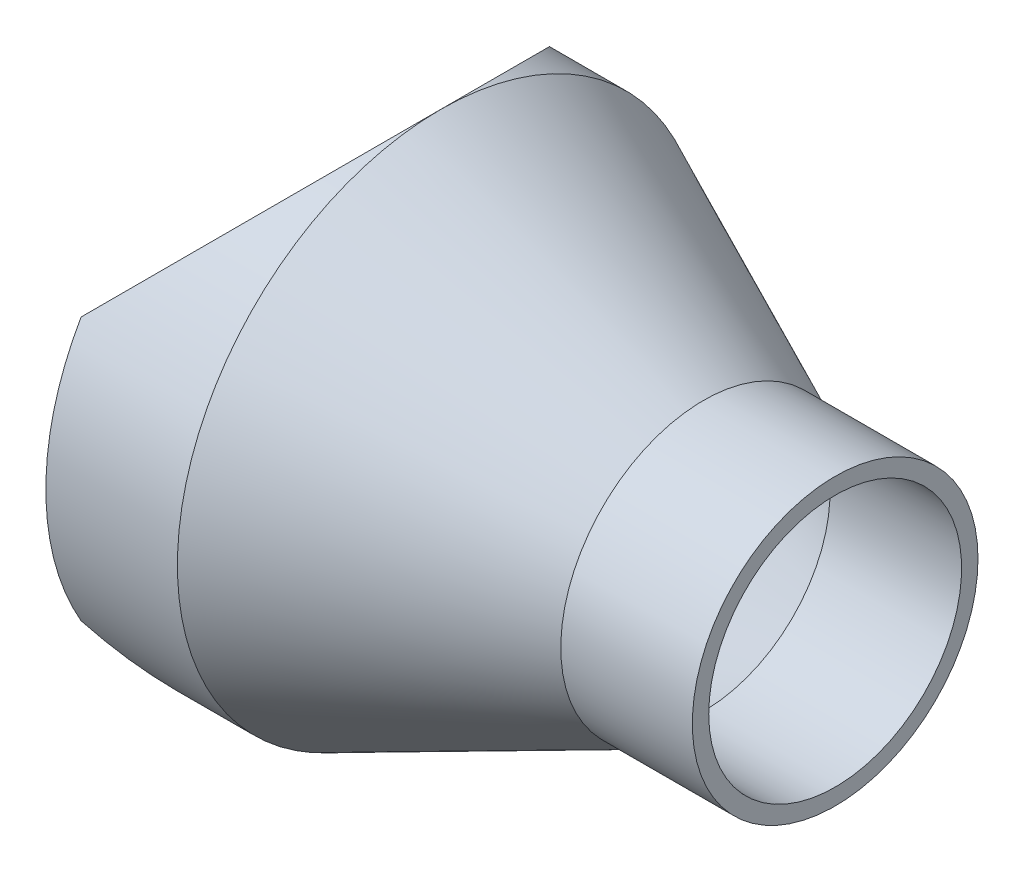
ISO-10303-21;
HEADER;
FILE_DESCRIPTION(('STEP AP214'),'2;1');
FILE_NAME('part.step','',(''),(''),'','','');
FILE_SCHEMA(('AUTOMOTIVE_DESIGN { 1 0 10303 214 1 1 1 1 }'));
ENDSEC;
DATA;
#1=APPLICATION_CONTEXT('core data for automotive mechanical design processes');
#2=APPLICATION_PROTOCOL_DEFINITION('international standard','automotive_design',2000,#1);
#3=PRODUCT_CONTEXT('',#1,'mechanical');
#4=PRODUCT('Part','Part','',(#3));
#5=PRODUCT_RELATED_PRODUCT_CATEGORY('part','',(#4));
#6=PRODUCT_DEFINITION_FORMATION('','',#4);
#7=PRODUCT_DEFINITION_CONTEXT('part definition',#1,'design');
#8=PRODUCT_DEFINITION('design','',#6,#7);
#9=PRODUCT_DEFINITION_SHAPE('','',#8);
#10=(LENGTH_UNIT() NAMED_UNIT(*) SI_UNIT(.MILLI.,.METRE.));
#11=(NAMED_UNIT(*) PLANE_ANGLE_UNIT() SI_UNIT($,.RADIAN.));
#12=(NAMED_UNIT(*) SI_UNIT($,.STERADIAN.) SOLID_ANGLE_UNIT());
#13=UNCERTAINTY_MEASURE_WITH_UNIT(LENGTH_MEASURE(1.E-05),#10,'distance_accuracy_value','');
#14=(GEOMETRIC_REPRESENTATION_CONTEXT(3) GLOBAL_UNCERTAINTY_ASSIGNED_CONTEXT((#13)) GLOBAL_UNIT_ASSIGNED_CONTEXT((#10,
#11,#12)) REPRESENTATION_CONTEXT('',''));
#15=CARTESIAN_POINT('',(0.,0.,0.));
#16=DIRECTION('',(0.,0.,1.));
#17=DIRECTION('',(1.,0.,0.));
#18=AXIS2_PLACEMENT_3D('',#15,#16,#17);
#19=CARTESIAN_POINT('',(22.2249999999994,0.,0.));
#20=DIRECTION('',(-1.,0.,0.));
#21=DIRECTION('',(0.,0.,1.));
#22=AXIS2_PLACEMENT_3D('',#19,#20,#21);
#23=CONICAL_SURFACE('',#22,41.4019999999986,0.423566498160204);
#24=CARTESIAN_POINT('',(66.675,0.,1.18438592267012E-13));
#25=DIRECTION('',(-1.,0.,0.));
#26=DIRECTION('',(0.,0.,1.));
#27=AXIS2_PLACEMENT_3D('',#24,#25,#26);
#28=CIRCLE('',#27,21.3614);
#29=CARTESIAN_POINT('',(66.675,0.,21.3614000000001));
#30=VERTEX_POINT('',#29);
#31=EDGE_CURVE('E105',#30,#30,#28,.F.);
#32=ORIENTED_EDGE('',*,*,#31,.T.);
#33=EDGE_LOOP('',(#32));
#34=FACE_BOUND('',#33,.T.);
#35=CARTESIAN_POINT('',(22.225,0.,0.));
#36=DIRECTION('',(-1.,0.,0.));
#37=DIRECTION('',(0.,0.,1.));
#38=AXIS2_PLACEMENT_3D('',#35,#36,#37);
#39=CIRCLE('',#38,41.402);
#40=CARTESIAN_POINT('',(22.2249999999982,-41.4019999999993,0.));
#41=VERTEX_POINT('',#40);
#42=CARTESIAN_POINT('',(22.2249999999982,41.4019999999993,0.));
#43=VERTEX_POINT('',#42);
#44=EDGE_CURVE('E103',#41,#43,#39,.T.);
#45=ORIENTED_EDGE('',*,*,#44,.T.);
#46=CARTESIAN_POINT('',(22.225,0.,0.));
#47=DIRECTION('',(-1.,0.,0.));
#48=DIRECTION('',(0.,0.,1.));
#49=AXIS2_PLACEMENT_3D('',#46,#47,#48);
#50=CIRCLE('',#49,41.402);
#51=EDGE_CURVE('E71',#43,#41,#50,.T.);
#52=ORIENTED_EDGE('',*,*,#51,.T.);
#53=EDGE_LOOP('',(#45,#52));
#54=FACE_BOUND('',#53,.T.);
#55=ADVANCED_FACE('F18',(#34,#54),#23,.F.);
#56=CARTESIAN_POINT('',(77.7875,0.,1.38178357644847E-13));
#57=DIRECTION('',(-1.,0.,0.));
#58=DIRECTION('',(0.,0.,1.));
#59=AXIS2_PLACEMENT_3D('',#56,#57,#58);
#60=CYLINDRICAL_SURFACE('',#59,21.3614);
#61=ORIENTED_EDGE('',*,*,#31,.F.);
#62=EDGE_LOOP('',(#61));
#63=FACE_BOUND('',#62,.T.);
#64=CARTESIAN_POINT('',(88.9,0.,1.57918123022682E-13));
#65=DIRECTION('',(-1.,0.,0.));
#66=DIRECTION('',(0.,0.,1.));
#67=AXIS2_PLACEMENT_3D('',#64,#65,#66);
#68=CIRCLE('',#67,21.3614);
#69=CARTESIAN_POINT('',(88.9,0.,21.3614000000002));
#70=VERTEX_POINT('',#69);
#71=EDGE_CURVE('E83',#70,#70,#68,.T.);
#72=ORIENTED_EDGE('',*,*,#71,.F.);
#73=EDGE_LOOP('',(#72));
#74=FACE_BOUND('',#73,.T.);
#75=ADVANCED_FACE('F166',(#63,#74),#60,.F.);
#76=CARTESIAN_POINT('',(11.1125,0.,0.));
#77=DIRECTION('',(-1.,0.,0.));
#78=DIRECTION('',(0.,0.,1.));
#79=AXIS2_PLACEMENT_3D('',#76,#77,#78);
#80=CYLINDRICAL_SURFACE('',#79,41.402);
#81=CARTESIAN_POINT('',(-1.50573997714787E-12,15.2405291574778,38.4948291982192));
#82=CARTESIAN_POINT('',(0.235429066097039,15.5838070863418,38.3589123540987));
#83=CARTESIAN_POINT('',(0.472920084740966,15.9240358700112,38.2189094271438));
#84=CARTESIAN_POINT('',(0.951190686752303,16.5986708903238,37.9307849976196));
#85=CARTESIAN_POINT('',(1.19197011775378,16.9330773951152,37.7826638702488));
#86=CARTESIAN_POINT('',(1.67597580964683,17.5963364836633,37.4783618549025));
#87=CARTESIAN_POINT('',(1.91920178123171,17.9251897120637,37.3221819110787));
#88=CARTESIAN_POINT('',(2.40744201135867,18.5775964235961,37.0017645687544));
#89=CARTESIAN_POINT('',(2.65245629426212,18.9011498343354,36.8375270603143));
#90=CARTESIAN_POINT('',(3.38993843899628,19.8650427515623,36.3322549818683));
#91=CARTESIAN_POINT('',(3.88418348208196,20.497713398756,35.9790749494401));
#92=CARTESIAN_POINT('',(4.87314660852457,21.7434086430539,35.2402344030287));
#93=CARTESIAN_POINT('',(5.36786470884381,22.3564325062301,34.8545726776023));
#94=CARTESIAN_POINT('',(6.3598023214071,23.5698421441031,34.045933689596));
#95=CARTESIAN_POINT('',(6.85698799828429,24.170010108916,33.6225875609375));
#96=CARTESIAN_POINT('',(7.84506977508413,25.3502721481776,32.7418913504769));
#97=CARTESIAN_POINT('',(8.33596579544579,25.9303659688561,32.2845408390334));
#98=CARTESIAN_POINT('',(9.30816420428777,27.0693830542778,31.335652651674));
#99=CARTESIAN_POINT('',(9.78947284658706,27.6283203489089,30.8441382674191));
#100=CARTESIAN_POINT('',(10.7398853080548,28.7242253096646,29.8262252868519));
#101=CARTESIAN_POINT('',(11.2089903466652,29.2611951739729,29.2998301947759));
#102=CARTESIAN_POINT('',(12.2936907410822,30.4955371462987,28.0212424097446));
#103=CARTESIAN_POINT('',(12.9031381205121,31.1833254677025,27.2544680531471));
#104=CARTESIAN_POINT('',(14.0872512599329,32.5114282470544,25.6556516355744));
#105=CARTESIAN_POINT('',(14.661918839661,33.1517451891794,24.8236129945752));
#106=CARTESIAN_POINT('',(15.7666429154123,34.3767038359366,23.0972697577161));
#107=CARTESIAN_POINT('',(16.2968543459491,34.9615399217948,22.2032031117847));
#108=CARTESIAN_POINT('',(17.3065109317384,36.070989578491,20.3512581007955));
#109=CARTESIAN_POINT('',(17.7859670823885,36.5956161949205,19.3933936301685));
#110=CARTESIAN_POINT('',(18.5976854652784,37.4811904709232,17.6089729718717));
#111=CARTESIAN_POINT('',(18.9404375874837,37.8541255122263,16.7931220500313));
#112=CARTESIAN_POINT('',(19.5824184075783,38.5512882225112,15.1241956325357));
#113=CARTESIAN_POINT('',(19.8816489477699,38.8755179532457,14.2711217145474));
#114=CARTESIAN_POINT('',(20.4314129512581,39.4703120476721,12.5324851092693));
#115=CARTESIAN_POINT('',(20.6820082356816,39.7409445488082,11.6469653901823));
#116=CARTESIAN_POINT('',(21.1304097368758,40.2246553705623,9.8473418990263));
#117=CARTESIAN_POINT('',(21.3282290253929,40.4377479430334,8.93324526776924));
#118=CARTESIAN_POINT('',(21.6169693420651,40.7485411576906,7.35682971559445));
#119=CARTESIAN_POINT('',(21.7221985642238,40.8617258524818,6.70011807867637));
#120=CARTESIAN_POINT('',(21.9034799513035,41.05663327395,5.37816218438005));
#121=CARTESIAN_POINT('',(21.979538533573,41.1383629205442,4.71291983701976));
#122=CARTESIAN_POINT('',(22.1018160048938,41.269726199574,3.37467970463411));
#123=CARTESIAN_POINT('',(22.1479545353336,41.319273397675,2.70166593498327));
#124=CARTESIAN_POINT('',(22.194151760926,41.368879342499,1.68985886380406));
#125=CARTESIAN_POINT('',(22.2057157530706,41.3812955271362,1.35212250581984));
#126=CARTESIAN_POINT('',(22.2211408532731,41.3978567771998,0.676265961891813));
#127=CARTESIAN_POINT('',(22.2250018369861,41.4020017091088,0.338145769840168));
#128=CARTESIAN_POINT('',(22.225,41.4019999999999,0.));
#129=B_SPLINE_CURVE_WITH_KNOTS('',3,(#81,#82,#83,#84,#85,#86,#87,#88,#89,#90,#91,#92,#93,#94,
#95,#96,#97,#98,#99,#100,#101,#102,#103,#104,#105,#106,#107,#108,#109,#110,#111,#112,#113,#114,
#115,#116,#117,#118,#119,#120,#121,#122,#123,#124,#125,#126,#127,#128),.UNSPECIFIED.,.F.,.F.,(4,
2,2,2,2,2,2,2,2,2,2,2,2,2,2,2,2,2,2,2,2,2,2,4),(0.,1.31358912647946,2.62711759397459,
3.94049251949133,5.25388537004443,7.8842461818138,10.5147051394646,13.1745619169049,
15.8344523070409,18.4925467404338,21.1503745361742,24.7377726528005,28.3249829081953,
31.8991211401375,35.4724834953112,38.3507013936524,41.228797419309,44.1032107353481,
46.9769114441144,48.9995600314854,51.0217633939074,53.0493756947168,54.0636983846912,
55.0780374481009),.UNSPECIFIED.);
#130=CARTESIAN_POINT('',(-1.196959198424E-12,15.2405291574782,38.494829198219));
#131=VERTEX_POINT('',#130);
#132=EDGE_CURVE('E76',#131,#43,#129,.T.);
#133=ORIENTED_EDGE('',*,*,#132,.T.);
#134=ORIENTED_EDGE('',*,*,#44,.F.);
#135=CARTESIAN_POINT('',(22.225,-41.4019999999999,0.));
#136=CARTESIAN_POINT('',(22.225015024021,-41.4020147610362,0.476649651600231));
#137=CARTESIAN_POINT('',(22.2173334510359,-41.3937690065097,0.953290041539717));
#138=CARTESIAN_POINT('',(22.1866894108465,-41.360867085597,1.90548964470357));
#139=CARTESIAN_POINT('',(22.1637276866474,-41.3362117171369,2.38104890937006));
#140=CARTESIAN_POINT('',(22.1026583005644,-41.2706255219092,3.32971789097985));
#141=CARTESIAN_POINT('',(22.0645618955001,-41.2297067914375,3.80282916433853));
#142=CARTESIAN_POINT('',(21.9734546556202,-41.1318223902823,4.74590915486049));
#143=CARTESIAN_POINT('',(21.9204437342321,-41.0748566264526,5.21587785376627));
#144=CARTESIAN_POINT('',(21.7404358994949,-40.8813519527827,6.61193856744317));
#145=CARTESIAN_POINT('',(21.5919369032945,-40.7216404732032,7.5322389846748));
#146=CARTESIAN_POINT('',(21.2403891094285,-40.3431290026959,9.34986888284318));
#147=CARTESIAN_POINT('',(21.0373327880229,-40.1243208620082,10.2471951768203));
#148=CARTESIAN_POINT('',(20.5811938339779,-39.632081332075,12.0108085915545));
#149=CARTESIAN_POINT('',(20.3282506334947,-39.3588021653747,12.8771744494351));
#150=CARTESIAN_POINT('',(19.7763538289742,-38.7614484218074,14.5769484501027));
#151=CARTESIAN_POINT('',(19.4774017589625,-38.4373755384958,15.4103576905635));
#152=CARTESIAN_POINT('',(18.8374892591557,-37.7421466530405,17.0424205742767));
#153=CARTESIAN_POINT('',(18.4964575296188,-37.3709107054342,17.8410120368052));
#154=CARTESIAN_POINT('',(17.777375544008,-36.5860338102199,19.3997287450738));
#155=CARTESIAN_POINT('',(17.3993204324267,-36.1723873002568,20.1598489255377));
#156=CARTESIAN_POINT('',(16.4517273829049,-35.1322533633663,21.9384860171736));
#157=CARTESIAN_POINT('',(15.8663945589395,-34.4871423655075,22.937770511638));
#158=CARTESIAN_POINT('',(14.6431507214339,-33.1310936711278,24.8563355269555));
#159=CARTESIAN_POINT('',(14.0052209814092,-32.420132518258,25.7755873115684));
#160=CARTESIAN_POINT('',(12.6855096919357,-30.9383395198577,27.5367606908141));
#161=CARTESIAN_POINT('',(12.0035987447332,-30.1673294807314,28.3784345857581));
#162=CARTESIAN_POINT('',(10.6078140186468,-28.5738443062427,29.9823135097052));
#163=CARTESIAN_POINT('',(9.8939422652536,-27.7513724309238,30.7445235645044));
#164=CARTESIAN_POINT('',(8.41634605782015,-26.0273087228184,32.2186216851702));
#165=CARTESIAN_POINT('',(7.65175704094319,-25.123901913926,32.9275221768553));
#166=CARTESIAN_POINT('',(6.49535023432495,-23.7328362761767,33.9294034144256));
#167=CARTESIAN_POINT('',(6.10824866363595,-23.2630986268757,34.2531528723291));
#168=CARTESIAN_POINT('',(5.33238980002331,-22.3116299389994,34.8803884237881));
#169=CARTESIAN_POINT('',(4.94363261443981,-21.829899668429,35.1838758103628));
#170=CARTESIAN_POINT('',(4.16963621284936,-20.858695886219,35.7681238190191));
#171=CARTESIAN_POINT('',(3.784396652198,-20.3693302680047,36.0490635393685));
#172=CARTESIAN_POINT('',(3.0158511057519,-19.3783779828488,36.5912978643994));
#173=CARTESIAN_POINT('',(2.63254505704099,-18.8767917167022,36.8525931122063));
#174=CARTESIAN_POINT('',(1.8701179676878,-17.8608678873232,37.3555384019048));
#175=CARTESIAN_POINT('',(1.49099624922846,-17.3465324344745,37.5971916671843));
#176=CARTESIAN_POINT('',(0.92743896426164,-16.5647544884543,37.9449052908015));
#177=CARTESIAN_POINT('',(0.740428366175091,-16.3024314191972,38.0583559083493));
#178=CARTESIAN_POINT('',(0.368523929768501,-15.7742041633433,38.2803096924151));
#179=CARTESIAN_POINT('',(0.183630153473516,-15.5082998723074,38.3888127142399));
#180=CARTESIAN_POINT('',(-1.49880108324396E-12,-15.2405291574778,38.4948291982192));
#181=B_SPLINE_CURVE_WITH_KNOTS('',3,(#135,#136,#137,#138,#139,#140,#141,#142,#143,#144,#145,
#146,#147,#148,#149,#150,#151,#152,#153,#154,#155,#156,#157,#158,#159,#160,#161,#162,#163,#164,
#165,#166,#167,#168,#169,#170,#171,#172,#173,#174,#175,#176,#177,#178,#179,#180),.UNSPECIFIED.,
.F.,.F.,(4,2,2,2,2,2,2,2,2,2,2,2,2,2,2,2,2,2,2,2,2,2,4),(0.,1.42979932976742,2.85952913987348,
4.28819753550977,5.7168742241171,8.55004768396273,11.3836120539446,14.2093661609205,
17.0350260721274,19.8655412768012,22.6964281935893,26.6674904797736,30.639972770252,
34.6247287051293,38.6092324657373,42.7442148489913,44.8121854982222,46.8800240540107,
48.9293549974956,50.9786188202568,53.027545662517,54.052146692189,55.0767776672833),.UNSPECIFIED.);
#182=CARTESIAN_POINT('',(0.,-15.2405291574782,38.494829198219));
#183=VERTEX_POINT('',#182);
#184=EDGE_CURVE('E94',#41,#183,#181,.T.);
#185=ORIENTED_EDGE('',*,*,#184,.T.);
#186=CARTESIAN_POINT('',(0.,0.,0.));
#187=DIRECTION('',(-1.,0.,0.));
#188=DIRECTION('',(0.,0.,1.));
#189=AXIS2_PLACEMENT_3D('',#186,#187,#188);
#190=CIRCLE('',#189,41.402);
#191=EDGE_CURVE('E101',#183,#131,#190,.T.);
#192=ORIENTED_EDGE('',*,*,#191,.T.);
#193=EDGE_LOOP('',(#133,#134,#185,#192));
#194=FACE_BOUND('',#193,.T.);
#195=ADVANCED_FACE('F168',(#194),#80,.F.);
#196=CARTESIAN_POINT('',(11.1125,0.,0.));
#197=DIRECTION('',(-1.,0.,0.));
#198=DIRECTION('',(0.,0.,1.));
#199=AXIS2_PLACEMENT_3D('',#196,#197,#198);
#200=CYLINDRICAL_SURFACE('',#199,41.402);
#201=CARTESIAN_POINT('',(-6.1409211049579E-13,-15.2405291574793,-38.4948291982186));
#202=CARTESIAN_POINT('',(0.235429066098079,-15.5838070863432,-38.3589123540981));
#203=CARTESIAN_POINT('',(0.472920084742068,-15.9240358700126,-38.2189094271432));
#204=CARTESIAN_POINT('',(0.951190686753452,-16.5986708903251,-37.930784997619));
#205=CARTESIAN_POINT('',(1.19197011775491,-16.9330773951166,-37.7826638702482));
#206=CARTESIAN_POINT('',(1.67597580964797,-17.5963364836646,-37.4783618549019));
#207=CARTESIAN_POINT('',(1.91920178123285,-17.9251897120651,-37.322181911078));
#208=CARTESIAN_POINT('',(2.40744201135981,-18.5775964235974,-37.0017645687537));
#209=CARTESIAN_POINT('',(2.65245629426326,-18.9011498343367,-36.8375270603136));
#210=CARTESIAN_POINT('',(3.38993843899741,-19.8650427515636,-36.3322549818675));
#211=CARTESIAN_POINT('',(3.8841834820831,-20.4977133987572,-35.9790749494394));
#212=CARTESIAN_POINT('',(4.87314660852571,-21.7434086430551,-35.2402344030279));
#213=CARTESIAN_POINT('',(5.36786470884495,-22.3564325062313,-34.8545726776015));
#214=CARTESIAN_POINT('',(6.35980232140822,-23.5698421441042,-34.0459336895952));
#215=CARTESIAN_POINT('',(6.85698799828541,-24.1700101089171,-33.6225875609366));
#216=CARTESIAN_POINT('',(7.84506977508523,-25.3502721481787,-32.741891350476));
#217=CARTESIAN_POINT('',(8.33596579544688,-25.9303659688572,-32.2845408390325));
#218=CARTESIAN_POINT('',(9.30816420428885,-27.0693830542789,-31.335652651673));
#219=CARTESIAN_POINT('',(9.78947284658817,-27.6283203489101,-30.8441382674181));
#220=CARTESIAN_POINT('',(10.7398853080558,-28.7242253096657,-29.8262252868508));
#221=CARTESIAN_POINT('',(11.2089903466661,-29.2611951739741,-29.2998301947746));
#222=CARTESIAN_POINT('',(12.293690741083,-30.4955371462997,-28.0212424097433));
#223=CARTESIAN_POINT('',(12.9031381205131,-31.1833254677036,-27.2544680531458));
#224=CARTESIAN_POINT('',(14.0872512599338,-32.5114282470553,-25.6556516355733));
#225=CARTESIAN_POINT('',(14.6619188396618,-33.1517451891803,-24.8236129945739));
#226=CARTESIAN_POINT('',(15.7666429154131,-34.3767038359374,-23.0972697577148));
#227=CARTESIAN_POINT('',(16.2968543459499,-34.9615399217956,-22.2032031117834));
#228=CARTESIAN_POINT('',(17.3065109317391,-36.0709895784917,-20.3512581007942));
#229=CARTESIAN_POINT('',(17.785967082389,-36.5956161949212,-19.3933936301672));
#230=CARTESIAN_POINT('',(18.5976854652789,-37.4811904709238,-17.6089729718705));
#231=CARTESIAN_POINT('',(18.9404375874842,-37.8541255122269,-16.79312205003));
#232=CARTESIAN_POINT('',(19.5824184075788,-38.5512882225116,-15.1241956325345));
#233=CARTESIAN_POINT('',(19.8816489477704,-38.8755179532461,-14.2711217145461));
#234=CARTESIAN_POINT('',(20.4314129512585,-39.4703120476725,-12.5324851092681));
#235=CARTESIAN_POINT('',(20.682008235682,-39.7409445488085,-11.646965390181));
#236=CARTESIAN_POINT('',(21.1304097368761,-40.2246553705626,-9.84734189902504));
#237=CARTESIAN_POINT('',(21.3282290253931,-40.4377479430337,-8.93324526776797));
#238=CARTESIAN_POINT('',(21.6169693420653,-40.7485411576908,-7.35682971559328));
#239=CARTESIAN_POINT('',(21.722198564224,-40.861725852482,-6.7001180786753));
#240=CARTESIAN_POINT('',(21.9034799513036,-41.0566332739501,-5.37816218437917));
#241=CARTESIAN_POINT('',(21.9795385335731,-41.1383629205442,-4.71291983701897));
#242=CARTESIAN_POINT('',(22.1018160048938,-41.2697261995741,-3.37467970463352));
#243=CARTESIAN_POINT('',(22.1479545353337,-41.319273397675,-2.70166593498278));
#244=CARTESIAN_POINT('',(22.194151760926,-41.3688793424991,-1.68985886380373));
#245=CARTESIAN_POINT('',(22.2057157530707,-41.3812955271362,-1.35212250581956));
#246=CARTESIAN_POINT('',(22.2211408532731,-41.3978567771998,-0.676265961891632));
#247=CARTESIAN_POINT('',(22.2250018369861,-41.4020017091088,-0.338145769840038));
#248=CARTESIAN_POINT('',(22.225,-41.4019999999999,0.));
#249=B_SPLINE_CURVE_WITH_KNOTS('',3,(#201,#202,#203,#204,#205,#206,#207,#208,#209,#210,#211,
#212,#213,#214,#215,#216,#217,#218,#219,#220,#221,#222,#223,#224,#225,#226,#227,#228,#229,#230,
#231,#232,#233,#234,#235,#236,#237,#238,#239,#240,#241,#242,#243,#244,#245,#246,#247,#248),
.UNSPECIFIED.,.F.,.F.,(4,2,2,2,2,2,2,2,2,2,2,2,2,2,2,2,2,2,2,2,2,2,2,4),(0.,1.31358912647945,
2.62711759397458,3.94049251949131,5.25388537004441,7.88424618181376,10.5147051394646,
13.1745619169049,15.8344523070409,18.4925467404337,21.1503745361742,24.7377726528004,
28.3249829081952,31.8991211401372,35.4724834953109,38.3507013936519,41.2287974193085,
44.1032107353475,46.9769114441138,48.9995600314845,51.0217633939062,53.0493756947153,
54.0636983846896,55.0780374480991),.UNSPECIFIED.);
#250=CARTESIAN_POINT('',(-1.36696209906972E-12,-15.2405291574782,-38.494829198219));
#251=VERTEX_POINT('',#250);
#252=EDGE_CURVE('E96',#251,#41,#249,.T.);
#253=ORIENTED_EDGE('',*,*,#252,.T.);
#254=ORIENTED_EDGE('',*,*,#51,.F.);
#255=CARTESIAN_POINT('',(22.225,41.4019999999999,0.));
#256=CARTESIAN_POINT('',(22.225015024021,41.4020147610362,-0.476649651600156));
#257=CARTESIAN_POINT('',(22.2173334510359,41.3937690065097,-0.953290041539644));
#258=CARTESIAN_POINT('',(22.1866894108465,41.360867085597,-1.9054896447035));
#259=CARTESIAN_POINT('',(22.1637276866474,41.3362117171369,-2.38104890937));
#260=CARTESIAN_POINT('',(22.1026583005644,41.2706255219092,-3.32971789097978));
#261=CARTESIAN_POINT('',(22.0645618955002,41.2297067914375,-3.80282916433846));
#262=CARTESIAN_POINT('',(21.9734546556202,41.1318223902823,-4.74590915486042));
#263=CARTESIAN_POINT('',(21.9204437342322,41.0748566264526,-5.2158778537662));
#264=CARTESIAN_POINT('',(21.740435899495,40.8813519527827,-6.6119385674431));
#265=CARTESIAN_POINT('',(21.5919369032946,40.7216404732031,-7.53223898467474));
#266=CARTESIAN_POINT('',(21.2403891094285,40.3431290026959,-9.34986888284311));
#267=CARTESIAN_POINT('',(21.0373327880227,40.1243208620082,-10.2471951768202));
#268=CARTESIAN_POINT('',(20.5811938339778,39.632081332075,-12.0108085915544));
#269=CARTESIAN_POINT('',(20.3282506334947,39.3588021653746,-12.8771744494351));
#270=CARTESIAN_POINT('',(19.7763538289742,38.7614484218074,-14.5769484501026));
#271=CARTESIAN_POINT('',(19.4774017589626,38.4373755384958,-15.4103576905635));
#272=CARTESIAN_POINT('',(18.8374892591557,37.7421466530405,-17.0424205742767));
#273=CARTESIAN_POINT('',(18.4964575296189,37.3709107054342,-17.8410120368052));
#274=CARTESIAN_POINT('',(17.777375544008,36.5860338102199,-19.3997287450738));
#275=CARTESIAN_POINT('',(17.3993204324267,36.1723873002568,-20.1598489255376));
#276=CARTESIAN_POINT('',(16.4517273829049,35.1322533633663,-21.9384860171735));
#277=CARTESIAN_POINT('',(15.8663945589395,34.4871423655074,-22.937770511638));
#278=CARTESIAN_POINT('',(14.643150721434,33.1310936711277,-24.8563355269555));
#279=CARTESIAN_POINT('',(14.0052209814093,32.420132518258,-25.7755873115684));
#280=CARTESIAN_POINT('',(12.6855096919357,30.9383395198577,-27.5367606908141));
#281=CARTESIAN_POINT('',(12.0035987447333,30.1673294807313,-28.3784345857581));
#282=CARTESIAN_POINT('',(10.6078140186468,28.5738443062427,-29.9823135097052));
#283=CARTESIAN_POINT('',(9.89394226525349,27.7513724309238,-30.7445235645044));
#284=CARTESIAN_POINT('',(8.41634605782013,26.0273087228185,-32.2186216851702));
#285=CARTESIAN_POINT('',(7.65175704094339,25.1239019139261,-32.9275221768552));
#286=CARTESIAN_POINT('',(6.49535023432533,23.732836276177,-33.9294034144253));
#287=CARTESIAN_POINT('',(6.10824866363637,23.263098626876,-34.2531528723289));
#288=CARTESIAN_POINT('',(5.33238980002381,22.3116299389999,-34.8803884237878));
#289=CARTESIAN_POINT('',(4.94363261444035,21.8298996684296,-35.1838758103625));
#290=CARTESIAN_POINT('',(4.16963621285001,20.8586958862196,-35.7681238190187));
#291=CARTESIAN_POINT('',(3.7843966521987,20.3693302680054,-36.0490635393681));
#292=CARTESIAN_POINT('',(3.01585110575269,19.3783779828496,-36.5912978643989));
#293=CARTESIAN_POINT('',(2.63254505704184,18.8767917167031,-36.8525931122058));
#294=CARTESIAN_POINT('',(1.87011796768871,17.8608678873242,-37.3555384019043));
#295=CARTESIAN_POINT('',(1.49099624922939,17.3465324344756,-37.5971916671838));
#296=CARTESIAN_POINT('',(0.927438964262657,16.5647544884556,-37.944905290801));
#297=CARTESIAN_POINT('',(0.740428366176143,16.3024314191984,-38.0583559083487));
#298=CARTESIAN_POINT('',(0.368523929769549,15.7742041633447,-38.2803096924145));
#299=CARTESIAN_POINT('',(0.183630153474526,15.5082998723089,-38.3888127142394));
#300=CARTESIAN_POINT('',(-6.10622663543836E-13,15.2405291574793,-38.4948291982186));
#301=B_SPLINE_CURVE_WITH_KNOTS('',3,(#255,#256,#257,#258,#259,#260,#261,#262,#263,#264,#265,
#266,#267,#268,#269,#270,#271,#272,#273,#274,#275,#276,#277,#278,#279,#280,#281,#282,#283,#284,
#285,#286,#287,#288,#289,#290,#291,#292,#293,#294,#295,#296,#297,#298,#299,#300),.UNSPECIFIED.,
.F.,.F.,(4,2,2,2,2,2,2,2,2,2,2,2,2,2,2,2,2,2,2,2,2,2,4),(0.,1.42979932976743,2.85952913987349,
4.28819753550978,5.71687422411711,8.55004768396274,11.3836120539447,14.2093661609205,
17.0350260721274,19.8655412768012,22.6964281935893,26.6674904797737,30.639972770252,
34.6247287051294,38.6092324657374,42.744214848991,44.8121854982216,46.8800240540099,
48.9293549974945,50.9786188202554,53.0275456625154,54.0521466921873,55.0767776672815),.UNSPECIFIED.);
#302=CARTESIAN_POINT('',(-3.46944695195361E-13,15.2405291574778,-38.4948291982192));
#303=VERTEX_POINT('',#302);
#304=EDGE_CURVE('E66',#43,#303,#301,.T.);
#305=ORIENTED_EDGE('',*,*,#304,.T.);
#306=CARTESIAN_POINT('',(0.,0.,0.));
#307=DIRECTION('',(-1.,0.,0.));
#308=DIRECTION('',(0.,0.,1.));
#309=AXIS2_PLACEMENT_3D('',#306,#307,#308);
#310=CIRCLE('',#309,41.402);
#311=EDGE_CURVE('E21',#303,#251,#310,.T.);
#312=ORIENTED_EDGE('',*,*,#311,.T.);
#313=EDGE_LOOP('',(#253,#254,#305,#312));
#314=FACE_BOUND('',#313,.T.);
#315=ADVANCED_FACE('F69',(#314),#200,.F.);
#316=CARTESIAN_POINT('',(0.,0.,0.));
#317=DIRECTION('',(1.,0.,0.));
#318=DIRECTION('',(0.,0.,-1.));
#319=AXIS2_PLACEMENT_3D('',#316,#317,#318);
#320=PLANE('',#319);
#321=DIRECTION('',(0.,1.,0.));
#322=VECTOR('',#321,1.);
#323=CARTESIAN_POINT('',(-2.65065747129256E-12,1930.4,-38.4948291982198));
#324=LINE('',#323,#322);
#325=CARTESIAN_POINT('',(-1.36349265211777E-12,22.2249999999986,-38.494829198219));
#326=VERTEX_POINT('',#325);
#327=EDGE_CURVE('E75',#303,#326,#324,.T.);
#328=ORIENTED_EDGE('',*,*,#327,.T.);
#329=CARTESIAN_POINT('',(0.,0.,0.));
#330=DIRECTION('',(1.,0.,0.));
#331=DIRECTION('',(0.,0.,-1.));
#332=AXIS2_PLACEMENT_3D('',#329,#330,#331);
#333=CIRCLE('',#332,44.45);
#334=CARTESIAN_POINT('',(-1.36349265211777E-12,-22.2249999999986,-38.494829198219));
#335=VERTEX_POINT('',#334);
#336=EDGE_CURVE('E158',#335,#326,#333,.T.);
#337=ORIENTED_EDGE('',*,*,#336,.F.);
#338=DIRECTION('',(0.,1.,0.));
#339=VECTOR('',#338,1.);
#340=CARTESIAN_POINT('',(-2.65065747129256E-12,1930.4,-38.4948291982198));
#341=LINE('',#340,#339);
#342=EDGE_CURVE('E81',#335,#251,#341,.T.);
#343=ORIENTED_EDGE('',*,*,#342,.T.);
#344=ORIENTED_EDGE('',*,*,#311,.F.);
#345=EDGE_LOOP('',(#328,#337,#343,#344));
#346=FACE_BOUND('',#345,.T.);
#347=ADVANCED_FACE('F79',(#346),#320,.F.);
#348=CARTESIAN_POINT('',(88.9,0.,1.57918123022682E-13));
#349=DIRECTION('',(1.,0.,0.));
#350=DIRECTION('',(0.,0.,-1.));
#351=AXIS2_PLACEMENT_3D('',#348,#349,#350);
#352=PLANE('',#351);
#353=ORIENTED_EDGE('',*,*,#71,.T.);
#354=EDGE_LOOP('',(#353));
#355=FACE_BOUND('',#354,.T.);
#356=CARTESIAN_POINT('',(88.9,0.,1.57918123022682E-13));
#357=DIRECTION('',(1.,0.,0.));
#358=DIRECTION('',(0.,0.,-1.));
#359=AXIS2_PLACEMENT_3D('',#356,#357,#358);
#360=CIRCLE('',#359,24.13);
#361=CARTESIAN_POINT('',(88.8999999999999,0.,-24.1299999999998));
#362=VERTEX_POINT('',#361);
#363=EDGE_CURVE('E86',#362,#362,#360,.F.);
#364=ORIENTED_EDGE('',*,*,#363,.F.);
#365=EDGE_LOOP('',(#364));
#366=FACE_BOUND('',#365,.T.);
#367=ADVANCED_FACE('F163',(#355,#366),#352,.T.);
#368=CARTESIAN_POINT('',(11.1125,0.,0.));
#369=DIRECTION('',(1.,0.,0.));
#370=DIRECTION('',(0.,0.,-1.));
#371=AXIS2_PLACEMENT_3D('',#368,#369,#370);
#372=CYLINDRICAL_SURFACE('',#371,44.45);
#373=CARTESIAN_POINT('',(22.2249999999989,0.,0.));
#374=DIRECTION('',(-1.,0.,0.));
#375=DIRECTION('',(0.,1.,0.));
#376=AXIS2_PLACEMENT_3D('',#373,#374,#375);
#377=CIRCLE('',#376,44.4499999999977);
#378=CARTESIAN_POINT('',(22.2249999999988,-44.4499999999985,0.));
#379=VERTEX_POINT('',#378);
#380=CARTESIAN_POINT('',(22.2249999999988,44.4499999999985,0.));
#381=VERTEX_POINT('',#380);
#382=EDGE_CURVE('E117',#379,#381,#377,.F.);
#383=ORIENTED_EDGE('',*,*,#382,.F.);
#384=CARTESIAN_POINT('',(-22.225,0.,0.));
#385=DIRECTION('',(0.707106781186547,0.707106781186547,0.));
#386=DIRECTION('',(-0.707106781186547,0.707106781186547,0.));
#387=AXIS2_PLACEMENT_3D('',#384,#385,#386);
#388=ELLIPSE('',#387,62.8617928474841,44.45);
#389=EDGE_CURVE('E97',#379,#335,#388,.T.);
#390=ORIENTED_EDGE('',*,*,#389,.T.);
#391=ORIENTED_EDGE('',*,*,#336,.T.);
#392=CARTESIAN_POINT('',(-22.225,0.,0.));
#393=DIRECTION('',(-0.707106781186547,0.707106781186547,0.));
#394=DIRECTION('',(0.707106781186547,0.707106781186547,0.));
#395=AXIS2_PLACEMENT_3D('',#392,#393,#394);
#396=ELLIPSE('',#395,62.8617928474841,44.45);
#397=EDGE_CURVE('E35',#326,#381,#396,.F.);
#398=ORIENTED_EDGE('',*,*,#397,.T.);
#399=EDGE_LOOP('',(#383,#390,#391,#398));
#400=FACE_BOUND('',#399,.T.);
#401=ADVANCED_FACE('F204',(#400),#372,.T.);
#402=CARTESIAN_POINT('',(0.,0.,0.));
#403=DIRECTION('',(1.,0.,0.));
#404=DIRECTION('',(0.,0.,-1.));
#405=AXIS2_PLACEMENT_3D('',#402,#403,#404);
#406=PLANE('',#405);
#407=DIRECTION('',(0.,1.,0.));
#408=VECTOR('',#407,1.);
#409=CARTESIAN_POINT('',(-2.47718512369488E-12,1930.4,38.4948291982198));
#410=LINE('',#409,#408);
#411=CARTESIAN_POINT('',(-1.196959198424E-12,22.2249999999988,38.494829198219));
#412=VERTEX_POINT('',#411);
#413=EDGE_CURVE('E91',#412,#131,#410,.F.);
#414=ORIENTED_EDGE('',*,*,#413,.T.);
#415=ORIENTED_EDGE('',*,*,#191,.F.);
#416=DIRECTION('',(0.,1.,0.));
#417=VECTOR('',#416,1.);
#418=CARTESIAN_POINT('',(-2.47718512369488E-12,1930.4,38.4948291982198));
#419=LINE('',#418,#417);
#420=CARTESIAN_POINT('',(-1.196959198424E-12,-22.2249999999988,38.494829198219));
#421=VERTEX_POINT('',#420);
#422=EDGE_CURVE('E98',#183,#421,#419,.F.);
#423=ORIENTED_EDGE('',*,*,#422,.T.);
#424=CARTESIAN_POINT('',(0.,0.,0.));
#425=DIRECTION('',(1.,0.,0.));
#426=DIRECTION('',(0.,0.,-1.));
#427=AXIS2_PLACEMENT_3D('',#424,#425,#426);
#428=CIRCLE('',#427,44.45);
#429=EDGE_CURVE('E114',#412,#421,#428,.T.);
#430=ORIENTED_EDGE('',*,*,#429,.F.);
#431=EDGE_LOOP('',(#414,#415,#423,#430));
#432=FACE_BOUND('',#431,.T.);
#433=ADVANCED_FACE('F143',(#432),#406,.F.);
#434=CARTESIAN_POINT('',(-22.225,1930.4,0.));
#435=DIRECTION('',(0.,1.,0.));
#436=DIRECTION('',(0.,0.,1.));
#437=AXIS2_PLACEMENT_3D('',#434,#435,#436);
#438=CYLINDRICAL_SURFACE('',#437,44.45);
#439=ORIENTED_EDGE('',*,*,#252,.F.);
#440=ORIENTED_EDGE('',*,*,#342,.F.);
#441=ORIENTED_EDGE('',*,*,#389,.F.);
#442=CARTESIAN_POINT('',(-22.225,0.,0.));
#443=DIRECTION('',(0.707106781186547,0.707106781186547,0.));
#444=DIRECTION('',(-0.707106781186547,0.707106781186547,0.));
#445=AXIS2_PLACEMENT_3D('',#442,#443,#444);
#446=ELLIPSE('',#445,62.8617928474841,44.45);
#447=EDGE_CURVE('E111',#421,#379,#446,.T.);
#448=ORIENTED_EDGE('',*,*,#447,.F.);
#449=ORIENTED_EDGE('',*,*,#422,.F.);
#450=ORIENTED_EDGE('',*,*,#184,.F.);
#451=EDGE_LOOP('',(#439,#440,#441,#448,#449,#450));
#452=FACE_BOUND('',#451,.T.);
#453=ADVANCED_FACE('F137',(#452),#438,.F.);
#454=CARTESIAN_POINT('',(-22.225,1930.4,0.));
#455=DIRECTION('',(0.,1.,0.));
#456=DIRECTION('',(0.,0.,1.));
#457=AXIS2_PLACEMENT_3D('',#454,#455,#456);
#458=CYLINDRICAL_SURFACE('',#457,44.45);
#459=ORIENTED_EDGE('',*,*,#397,.F.);
#460=ORIENTED_EDGE('',*,*,#327,.F.);
#461=ORIENTED_EDGE('',*,*,#304,.F.);
#462=ORIENTED_EDGE('',*,*,#132,.F.);
#463=ORIENTED_EDGE('',*,*,#413,.F.);
#464=CARTESIAN_POINT('',(-22.225,0.,0.));
#465=DIRECTION('',(-0.707106781186547,0.707106781186547,0.));
#466=DIRECTION('',(0.707106781186547,0.707106781186547,0.));
#467=AXIS2_PLACEMENT_3D('',#464,#465,#466);
#468=ELLIPSE('',#467,62.8617928474841,44.45);
#469=EDGE_CURVE('E108',#381,#412,#468,.F.);
#470=ORIENTED_EDGE('',*,*,#469,.F.);
#471=EDGE_LOOP('',(#459,#460,#461,#462,#463,#470));
#472=FACE_BOUND('',#471,.T.);
#473=ADVANCED_FACE('F84',(#472),#458,.F.);
#474=CARTESIAN_POINT('',(77.7875,0.,1.38178357644847E-13));
#475=DIRECTION('',(1.,0.,0.));
#476=DIRECTION('',(0.,0.,-1.));
#477=AXIS2_PLACEMENT_3D('',#474,#475,#476);
#478=CYLINDRICAL_SURFACE('',#477,24.13);
#479=ORIENTED_EDGE('',*,*,#363,.T.);
#480=EDGE_LOOP('',(#479));
#481=FACE_BOUND('',#480,.T.);
#482=CARTESIAN_POINT('',(66.6750000000011,0.,1.18438592267013E-13));
#483=DIRECTION('',(-1.,0.,0.));
#484=DIRECTION('',(0.,-1.,0.));
#485=AXIS2_PLACEMENT_3D('',#482,#483,#484);
#486=CIRCLE('',#485,24.1300000000023);
#487=CARTESIAN_POINT('',(66.6750000000011,-24.1300000000023,1.18438592267013E-13));
#488=VERTEX_POINT('',#487);
#489=EDGE_CURVE('E26',#488,#488,#486,.T.);
#490=ORIENTED_EDGE('',*,*,#489,.F.);
#491=EDGE_LOOP('',(#490));
#492=FACE_BOUND('',#491,.T.);
#493=ADVANCED_FACE('F136',(#481,#492),#478,.T.);
#494=CARTESIAN_POINT('',(11.1125,0.,0.));
#495=DIRECTION('',(1.,0.,0.));
#496=DIRECTION('',(0.,0.,-1.));
#497=AXIS2_PLACEMENT_3D('',#494,#495,#496);
#498=CYLINDRICAL_SURFACE('',#497,44.45);
#499=CARTESIAN_POINT('',(22.2249999999989,0.,0.));
#500=DIRECTION('',(-1.,0.,0.));
#501=DIRECTION('',(0.,-1.,0.));
#502=AXIS2_PLACEMENT_3D('',#499,#500,#501);
#503=CIRCLE('',#502,44.4499999999977);
#504=EDGE_CURVE('E12',#381,#379,#503,.F.);
#505=ORIENTED_EDGE('',*,*,#504,.F.);
#506=ORIENTED_EDGE('',*,*,#469,.T.);
#507=ORIENTED_EDGE('',*,*,#429,.T.);
#508=ORIENTED_EDGE('',*,*,#447,.T.);
#509=EDGE_LOOP('',(#505,#506,#507,#508));
#510=FACE_BOUND('',#509,.T.);
#511=ADVANCED_FACE('F180',(#510),#498,.T.);
#512=CARTESIAN_POINT('',(22.2249999999989,0.,0.));
#513=DIRECTION('',(-1.,0.,0.));
#514=DIRECTION('',(0.,0.,1.));
#515=AXIS2_PLACEMENT_3D('',#512,#513,#514);
#516=CONICAL_SURFACE('',#515,44.4499999999977,0.428778027445913);
#517=ORIENTED_EDGE('',*,*,#489,.T.);
#518=EDGE_LOOP('',(#517));
#519=FACE_BOUND('',#518,.T.);
#520=ORIENTED_EDGE('',*,*,#504,.T.);
#521=ORIENTED_EDGE('',*,*,#382,.T.);
#522=EDGE_LOOP('',(#520,#521));
#523=FACE_BOUND('',#522,.T.);
#524=ADVANCED_FACE('F178',(#519,#523),#516,.T.);
#525=CLOSED_SHELL('',(#55,#75,#195,#315,#347,#367,#401,#433,#453,#473,#493,#511,#524));
#526=MANIFOLD_SOLID_BREP('B1',#525);
#527=ADVANCED_BREP_SHAPE_REPRESENTATION('',(#18,#526),#14);
#528=SHAPE_DEFINITION_REPRESENTATION(#9,#527);
ENDSEC;
END-ISO-10303-21;
